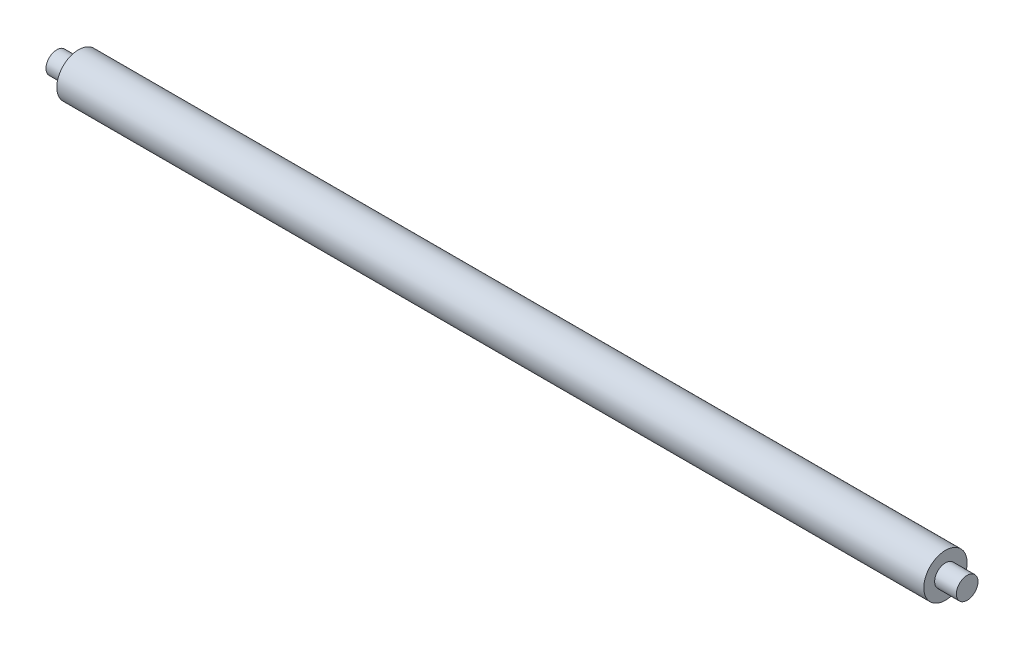
ISO-10303-21;
HEADER;
FILE_DESCRIPTION(('STEP AP214'),'2;1');
FILE_NAME('part.step','',(''),(''),'','','');
FILE_SCHEMA(('AUTOMOTIVE_DESIGN { 1 0 10303 214 1 1 1 1 }'));
ENDSEC;
DATA;
#1=APPLICATION_CONTEXT('core data for automotive mechanical design processes');
#2=APPLICATION_PROTOCOL_DEFINITION('international standard','automotive_design',2000,#1);
#3=PRODUCT_CONTEXT('',#1,'mechanical');
#4=PRODUCT('Part','Part','',(#3));
#5=PRODUCT_RELATED_PRODUCT_CATEGORY('part','',(#4));
#6=PRODUCT_DEFINITION_FORMATION('','',#4);
#7=PRODUCT_DEFINITION_CONTEXT('part definition',#1,'design');
#8=PRODUCT_DEFINITION('design','',#6,#7);
#9=PRODUCT_DEFINITION_SHAPE('','',#8);
#10=(LENGTH_UNIT() NAMED_UNIT(*) SI_UNIT(.MILLI.,.METRE.));
#11=(NAMED_UNIT(*) PLANE_ANGLE_UNIT() SI_UNIT($,.RADIAN.));
#12=(NAMED_UNIT(*) SI_UNIT($,.STERADIAN.) SOLID_ANGLE_UNIT());
#13=UNCERTAINTY_MEASURE_WITH_UNIT(LENGTH_MEASURE(1.E-05),#10,'distance_accuracy_value','');
#14=(GEOMETRIC_REPRESENTATION_CONTEXT(3) GLOBAL_UNCERTAINTY_ASSIGNED_CONTEXT((#13)) GLOBAL_UNIT_ASSIGNED_CONTEXT((#10,
#11,#12)) REPRESENTATION_CONTEXT('',''));
#15=CARTESIAN_POINT('',(0.,0.,0.));
#16=DIRECTION('',(0.,0.,1.));
#17=DIRECTION('',(1.,0.,0.));
#18=AXIS2_PLACEMENT_3D('',#15,#16,#17);
#19=CARTESIAN_POINT('',(100.,0.,0.));
#20=DIRECTION('',(-1.,0.,0.));
#21=DIRECTION('',(0.,0.,1.));
#22=AXIS2_PLACEMENT_3D('',#19,#20,#21);
#23=CYLINDRICAL_SURFACE('',#22,5.);
#24=CARTESIAN_POINT('',(100.,0.,0.));
#25=DIRECTION('',(1.,0.,0.));
#26=DIRECTION('',(0.,0.,-1.));
#27=AXIS2_PLACEMENT_3D('',#24,#25,#26);
#28=CIRCLE('',#27,5.);
#29=CARTESIAN_POINT('',(100.,0.,-5.));
#30=VERTEX_POINT('',#29);
#31=EDGE_CURVE('E12',#30,#30,#28,.T.);
#32=ORIENTED_EDGE('',*,*,#31,.F.);
#33=EDGE_LOOP('',(#32));
#34=FACE_BOUND('',#33,.T.);
#35=CARTESIAN_POINT('',(-100.,0.,0.));
#36=DIRECTION('',(1.,0.,0.));
#37=DIRECTION('',(0.,0.,-1.));
#38=AXIS2_PLACEMENT_3D('',#35,#36,#37);
#39=CIRCLE('',#38,5.);
#40=CARTESIAN_POINT('',(-100.,0.,-5.00000000000003));
#41=VERTEX_POINT('',#40);
#42=EDGE_CURVE('E51',#41,#41,#39,.T.);
#43=ORIENTED_EDGE('',*,*,#42,.T.);
#44=EDGE_LOOP('',(#43));
#45=FACE_BOUND('',#44,.T.);
#46=ADVANCED_FACE('F48',(#34,#45),#23,.T.);
#47=CARTESIAN_POINT('',(100.,0.,0.));
#48=DIRECTION('',(1.,0.,0.));
#49=DIRECTION('',(0.,0.,-1.));
#50=AXIS2_PLACEMENT_3D('',#47,#48,#49);
#51=PLANE('',#50);
#52=CARTESIAN_POINT('',(100.,0.,0.));
#53=DIRECTION('',(1.,0.,0.));
#54=DIRECTION('',(0.,0.,-1.));
#55=AXIS2_PLACEMENT_3D('',#52,#53,#54);
#56=CIRCLE('',#55,2.5);
#57=CARTESIAN_POINT('',(100.,0.,-2.5));
#58=VERTEX_POINT('',#57);
#59=EDGE_CURVE('E63',#58,#58,#56,.T.);
#60=ORIENTED_EDGE('',*,*,#59,.F.);
#61=EDGE_LOOP('',(#60));
#62=FACE_BOUND('',#61,.T.);
#63=ORIENTED_EDGE('',*,*,#31,.T.);
#64=EDGE_LOOP('',(#63));
#65=FACE_BOUND('',#64,.T.);
#66=ADVANCED_FACE('F92',(#62,#65),#51,.T.);
#67=CARTESIAN_POINT('',(-100.,0.,0.));
#68=DIRECTION('',(1.,0.,0.));
#69=DIRECTION('',(0.,0.,-1.));
#70=AXIS2_PLACEMENT_3D('',#67,#68,#69);
#71=PLANE('',#70);
#72=CARTESIAN_POINT('',(-100.,0.,0.));
#73=DIRECTION('',(1.,0.,0.));
#74=DIRECTION('',(0.,0.,-1.));
#75=AXIS2_PLACEMENT_3D('',#72,#73,#74);
#76=CIRCLE('',#75,2.5);
#77=CARTESIAN_POINT('',(-100.,0.,-2.50000000000003));
#78=VERTEX_POINT('',#77);
#79=EDGE_CURVE('E71',#78,#78,#76,.T.);
#80=ORIENTED_EDGE('',*,*,#79,.T.);
#81=EDGE_LOOP('',(#80));
#82=FACE_BOUND('',#81,.T.);
#83=ORIENTED_EDGE('',*,*,#42,.F.);
#84=EDGE_LOOP('',(#83));
#85=FACE_BOUND('',#84,.T.);
#86=ADVANCED_FACE('F97',(#82,#85),#71,.F.);
#87=CARTESIAN_POINT('',(105.,0.,0.));
#88=DIRECTION('',(-1.,0.,0.));
#89=DIRECTION('',(0.,0.,1.));
#90=AXIS2_PLACEMENT_3D('',#87,#88,#89);
#91=CYLINDRICAL_SURFACE('',#90,2.5);
#92=CARTESIAN_POINT('',(105.,0.,0.));
#93=DIRECTION('',(1.,0.,0.));
#94=DIRECTION('',(0.,0.,-1.));
#95=AXIS2_PLACEMENT_3D('',#92,#93,#94);
#96=CIRCLE('',#95,2.5);
#97=CARTESIAN_POINT('',(105.,0.,-2.5));
#98=VERTEX_POINT('',#97);
#99=EDGE_CURVE('E61',#98,#98,#96,.T.);
#100=ORIENTED_EDGE('',*,*,#99,.F.);
#101=EDGE_LOOP('',(#100));
#102=FACE_BOUND('',#101,.T.);
#103=ORIENTED_EDGE('',*,*,#59,.T.);
#104=EDGE_LOOP('',(#103));
#105=FACE_BOUND('',#104,.T.);
#106=ADVANCED_FACE('F104',(#102,#105),#91,.T.);
#107=CARTESIAN_POINT('',(105.,0.,0.));
#108=DIRECTION('',(1.,0.,0.));
#109=DIRECTION('',(0.,0.,-1.));
#110=AXIS2_PLACEMENT_3D('',#107,#108,#109);
#111=PLANE('',#110);
#112=ORIENTED_EDGE('',*,*,#99,.T.);
#113=EDGE_LOOP('',(#112));
#114=FACE_BOUND('',#113,.T.);
#115=ADVANCED_FACE('F89',(#114),#111,.T.);
#116=CARTESIAN_POINT('',(-105.,0.,0.));
#117=DIRECTION('',(1.,0.,0.));
#118=DIRECTION('',(0.,0.,-1.));
#119=AXIS2_PLACEMENT_3D('',#116,#117,#118);
#120=CYLINDRICAL_SURFACE('',#119,2.5);
#121=CARTESIAN_POINT('',(-105.,0.,0.));
#122=DIRECTION('',(1.,0.,0.));
#123=DIRECTION('',(0.,0.,-1.));
#124=AXIS2_PLACEMENT_3D('',#121,#122,#123);
#125=CIRCLE('',#124,2.5);
#126=CARTESIAN_POINT('',(-105.,0.,-2.50000000000006));
#127=VERTEX_POINT('',#126);
#128=EDGE_CURVE('E67',#127,#127,#125,.T.);
#129=ORIENTED_EDGE('',*,*,#128,.T.);
#130=EDGE_LOOP('',(#129));
#131=FACE_BOUND('',#130,.T.);
#132=ORIENTED_EDGE('',*,*,#79,.F.);
#133=EDGE_LOOP('',(#132));
#134=FACE_BOUND('',#133,.T.);
#135=ADVANCED_FACE('F80',(#131,#134),#120,.T.);
#136=CARTESIAN_POINT('',(-105.,0.,0.));
#137=DIRECTION('',(-1.,0.,0.));
#138=DIRECTION('',(0.,0.,-1.));
#139=AXIS2_PLACEMENT_3D('',#136,#137,#138);
#140=PLANE('',#139);
#141=ORIENTED_EDGE('',*,*,#128,.F.);
#142=EDGE_LOOP('',(#141));
#143=FACE_BOUND('',#142,.T.);
#144=ADVANCED_FACE('F83',(#143),#140,.T.);
#145=CLOSED_SHELL('',(#46,#66,#86,#106,#115,#135,#144));
#146=MANIFOLD_SOLID_BREP('B2',#145);
#147=ADVANCED_BREP_SHAPE_REPRESENTATION('',(#18,#146),#14);
#148=SHAPE_DEFINITION_REPRESENTATION(#9,#147);
ENDSEC;
END-ISO-10303-21;
